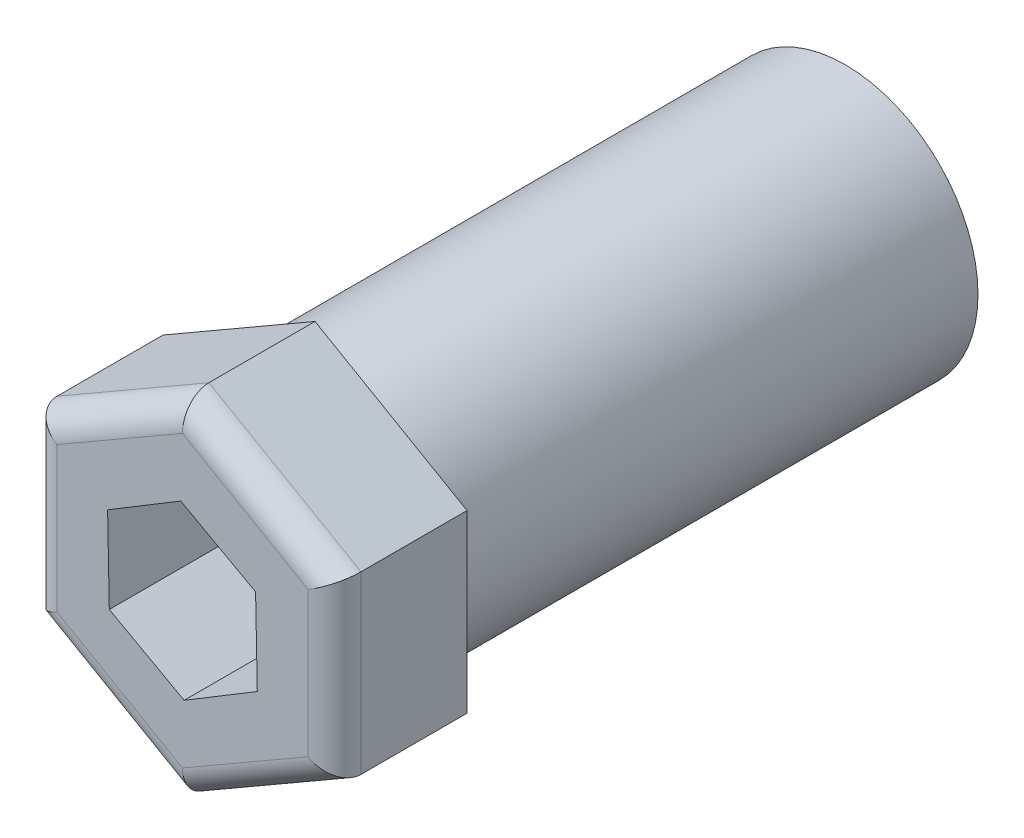
ISO-10303-21;
HEADER;
FILE_DESCRIPTION(('STEP AP214'),'2;1');
FILE_NAME('part.step','',(''),(''),'','','');
FILE_SCHEMA(('AUTOMOTIVE_DESIGN { 1 0 10303 214 1 1 1 1 }'));
ENDSEC;
DATA;
#1=APPLICATION_CONTEXT('core data for automotive mechanical design processes');
#2=APPLICATION_PROTOCOL_DEFINITION('international standard','automotive_design',2000,#1);
#3=PRODUCT_CONTEXT('',#1,'mechanical');
#4=PRODUCT('Part','Part','',(#3));
#5=PRODUCT_RELATED_PRODUCT_CATEGORY('part','',(#4));
#6=PRODUCT_DEFINITION_FORMATION('','',#4);
#7=PRODUCT_DEFINITION_CONTEXT('part definition',#1,'design');
#8=PRODUCT_DEFINITION('design','',#6,#7);
#9=PRODUCT_DEFINITION_SHAPE('','',#8);
#10=(LENGTH_UNIT() NAMED_UNIT(*) SI_UNIT(.MILLI.,.METRE.));
#11=(NAMED_UNIT(*) PLANE_ANGLE_UNIT() SI_UNIT($,.RADIAN.));
#12=(NAMED_UNIT(*) SI_UNIT($,.STERADIAN.) SOLID_ANGLE_UNIT());
#13=UNCERTAINTY_MEASURE_WITH_UNIT(LENGTH_MEASURE(1.E-05),#10,'distance_accuracy_value','');
#14=(GEOMETRIC_REPRESENTATION_CONTEXT(3) GLOBAL_UNCERTAINTY_ASSIGNED_CONTEXT((#13)) GLOBAL_UNIT_ASSIGNED_CONTEXT((#10,
#11,#12)) REPRESENTATION_CONTEXT('',''));
#15=CARTESIAN_POINT('',(0.,0.,0.));
#16=DIRECTION('',(0.,0.,1.));
#17=DIRECTION('',(1.,0.,0.));
#18=AXIS2_PLACEMENT_3D('',#15,#16,#17);
#19=CARTESIAN_POINT('',(0.,0.,4.));
#20=DIRECTION('',(0.,0.,-1.));
#21=DIRECTION('',(-1.,0.,0.));
#22=AXIS2_PLACEMENT_3D('',#19,#20,#21);
#23=CYLINDRICAL_SURFACE('',#22,1.);
#24=CARTESIAN_POINT('',(0.,0.,4.));
#25=DIRECTION('',(0.,0.,1.));
#26=DIRECTION('',(1.,0.,0.));
#27=AXIS2_PLACEMENT_3D('',#24,#25,#26);
#28=CIRCLE('',#27,1.);
#29=CARTESIAN_POINT('',(1.,0.,4.));
#30=VERTEX_POINT('',#29);
#31=EDGE_CURVE('E232',#30,#30,#28,.T.);
#32=ORIENTED_EDGE('',*,*,#31,.F.);
#33=EDGE_LOOP('',(#32));
#34=FACE_BOUND('',#33,.T.);
#35=CARTESIAN_POINT('',(0.,0.,0.));
#36=DIRECTION('',(0.,0.,1.));
#37=DIRECTION('',(1.,0.,0.));
#38=AXIS2_PLACEMENT_3D('',#35,#36,#37);
#39=CIRCLE('',#38,1.);
#40=CARTESIAN_POINT('',(1.,0.,0.));
#41=VERTEX_POINT('',#40);
#42=EDGE_CURVE('E231',#41,#41,#39,.T.);
#43=ORIENTED_EDGE('',*,*,#42,.T.);
#44=EDGE_LOOP('',(#43));
#45=FACE_BOUND('',#44,.T.);
#46=ADVANCED_FACE('F35',(#34,#45),#23,.T.);
#47=CARTESIAN_POINT('',(0.,0.,0.));
#48=DIRECTION('',(0.,0.,1.));
#49=DIRECTION('',(1.,0.,0.));
#50=AXIS2_PLACEMENT_3D('',#47,#48,#49);
#51=PLANE('',#50);
#52=ORIENTED_EDGE('',*,*,#42,.F.);
#53=EDGE_LOOP('',(#52));
#54=FACE_BOUND('',#53,.T.);
#55=ADVANCED_FACE('F326',(#54),#51,.F.);
#56=CARTESIAN_POINT('',(1.146400748658,0.661874780836902,5.));
#57=DIRECTION('',(-0.499999999999995,-0.866025403784441,0.));
#58=DIRECTION('',(0.866025403784442,-0.499999999999995,0.));
#59=AXIS2_PLACEMENT_3D('',#56,#57,#58);
#60=PLANE('',#59);
#61=DIRECTION('',(0.,0.,-1.));
#62=VECTOR('',#61,1.);
#63=CARTESIAN_POINT('',(0.,1.32374956167378,5.));
#64=LINE('',#63,#62);
#65=CARTESIAN_POINT('',(0.,1.32374956167378,4.8));
#66=VERTEX_POINT('',#65);
#67=CARTESIAN_POINT('',(0.,1.32374956167378,4.));
#68=VERTEX_POINT('',#67);
#69=EDGE_CURVE('E229',#66,#68,#64,.T.);
#70=ORIENTED_EDGE('',*,*,#69,.F.);
#71=DIRECTION('',(-0.866025403784442,0.499999999999995,0.));
#72=VECTOR('',#71,1.);
#73=CARTESIAN_POINT('',(1.146400748658,0.661874780836902,4.8));
#74=LINE('',#73,#72);
#75=CARTESIAN_POINT('',(1.146400748658,0.661874780836902,4.8));
#76=VERTEX_POINT('',#75);
#77=EDGE_CURVE('E44',#66,#76,#74,.F.);
#78=ORIENTED_EDGE('',*,*,#77,.T.);
#79=DIRECTION('',(0.,0.,-1.));
#80=VECTOR('',#79,1.);
#81=CARTESIAN_POINT('',(1.146400748658,0.661874780836902,5.));
#82=LINE('',#81,#80);
#83=CARTESIAN_POINT('',(1.146400748658,0.661874780836902,4.));
#84=VERTEX_POINT('',#83);
#85=EDGE_CURVE('E219',#76,#84,#82,.T.);
#86=ORIENTED_EDGE('',*,*,#85,.T.);
#87=DIRECTION('',(-0.866025403784441,0.499999999999995,0.));
#88=VECTOR('',#87,1.);
#89=CARTESIAN_POINT('',(1.146400748658,0.661874780836902,4.));
#90=LINE('',#89,#88);
#91=EDGE_CURVE('E194',#84,#68,#90,.T.);
#92=ORIENTED_EDGE('',*,*,#91,.T.);
#93=EDGE_LOOP('',(#70,#78,#86,#92));
#94=FACE_BOUND('',#93,.T.);
#95=ADVANCED_FACE('F317',(#94),#60,.F.);
#96=CARTESIAN_POINT('',(0.,1.32374956167378,5.));
#97=DIRECTION('',(0.500000000000001,-0.866025403784438,0.));
#98=DIRECTION('',(0.866025403784438,0.500000000000001,0.));
#99=AXIS2_PLACEMENT_3D('',#96,#97,#98);
#100=PLANE('',#99);
#101=DIRECTION('',(0.,0.,-1.));
#102=VECTOR('',#101,1.);
#103=CARTESIAN_POINT('',(-1.14640074865801,0.661874780836886,5.));
#104=LINE('',#103,#102);
#105=CARTESIAN_POINT('',(-1.14640074865801,0.661874780836886,4.8));
#106=VERTEX_POINT('',#105);
#107=CARTESIAN_POINT('',(-1.14640074865801,0.661874780836886,4.));
#108=VERTEX_POINT('',#107);
#109=EDGE_CURVE('E227',#106,#108,#104,.T.);
#110=ORIENTED_EDGE('',*,*,#109,.F.);
#111=DIRECTION('',(-0.866025403784438,-0.500000000000001,0.));
#112=VECTOR('',#111,1.);
#113=CARTESIAN_POINT('',(0.,1.32374956167378,4.8));
#114=LINE('',#113,#112);
#115=EDGE_CURVE('E59',#106,#66,#114,.F.);
#116=ORIENTED_EDGE('',*,*,#115,.T.);
#117=ORIENTED_EDGE('',*,*,#69,.T.);
#118=DIRECTION('',(-0.866025403784438,-0.500000000000001,0.));
#119=VECTOR('',#118,1.);
#120=CARTESIAN_POINT('',(0.,1.32374956167378,4.));
#121=LINE('',#120,#119);
#122=EDGE_CURVE('E204',#68,#108,#121,.T.);
#123=ORIENTED_EDGE('',*,*,#122,.T.);
#124=EDGE_LOOP('',(#110,#116,#117,#123));
#125=FACE_BOUND('',#124,.T.);
#126=ADVANCED_FACE('F318',(#125),#100,.F.);
#127=CARTESIAN_POINT('',(-1.14640074865801,0.661874780836886,5.));
#128=DIRECTION('',(1.,0.,0.));
#129=DIRECTION('',(0.,1.,0.));
#130=AXIS2_PLACEMENT_3D('',#127,#128,#129);
#131=PLANE('',#130);
#132=DIRECTION('',(0.,0.,-1.));
#133=VECTOR('',#132,1.);
#134=CARTESIAN_POINT('',(-1.146400748658,-0.661874780836894,5.));
#135=LINE('',#134,#133);
#136=CARTESIAN_POINT('',(-1.146400748658,-0.661874780836894,4.8));
#137=VERTEX_POINT('',#136);
#138=CARTESIAN_POINT('',(-1.146400748658,-0.661874780836894,4.));
#139=VERTEX_POINT('',#138);
#140=EDGE_CURVE('E225',#137,#139,#135,.T.);
#141=ORIENTED_EDGE('',*,*,#140,.F.);
#142=DIRECTION('',(0.,-1.,0.));
#143=VECTOR('',#142,1.);
#144=CARTESIAN_POINT('',(-1.14640074865801,0.661874780836886,4.8));
#145=LINE('',#144,#143);
#146=EDGE_CURVE('E255',#137,#106,#145,.F.);
#147=ORIENTED_EDGE('',*,*,#146,.T.);
#148=ORIENTED_EDGE('',*,*,#109,.T.);
#149=DIRECTION('',(0.,-1.,0.));
#150=VECTOR('',#149,1.);
#151=CARTESIAN_POINT('',(-1.14640074865801,0.661874780836886,4.));
#152=LINE('',#151,#150);
#153=EDGE_CURVE('E207',#108,#139,#152,.T.);
#154=ORIENTED_EDGE('',*,*,#153,.T.);
#155=EDGE_LOOP('',(#141,#147,#148,#154));
#156=FACE_BOUND('',#155,.T.);
#157=ADVANCED_FACE('F310',(#156),#131,.F.);
#158=CARTESIAN_POINT('',(-1.146400748658,-0.661874780836894,5.));
#159=DIRECTION('',(0.499999999999995,0.866025403784442,0.));
#160=DIRECTION('',(-0.866025403784442,0.499999999999995,0.));
#161=AXIS2_PLACEMENT_3D('',#158,#159,#160);
#162=PLANE('',#161);
#163=DIRECTION('',(0.,0.,-1.));
#164=VECTOR('',#163,1.);
#165=CARTESIAN_POINT('',(0.,-1.32374956167378,5.));
#166=LINE('',#165,#164);
#167=CARTESIAN_POINT('',(0.,-1.32374956167378,4.8));
#168=VERTEX_POINT('',#167);
#169=CARTESIAN_POINT('',(0.,-1.32374956167378,4.));
#170=VERTEX_POINT('',#169);
#171=EDGE_CURVE('E223',#168,#170,#166,.T.);
#172=ORIENTED_EDGE('',*,*,#171,.F.);
#173=DIRECTION('',(0.866025403784442,-0.499999999999995,0.));
#174=VECTOR('',#173,1.);
#175=CARTESIAN_POINT('',(-1.146400748658,-0.661874780836894,4.8));
#176=LINE('',#175,#174);
#177=EDGE_CURVE('E253',#168,#137,#176,.F.);
#178=ORIENTED_EDGE('',*,*,#177,.T.);
#179=ORIENTED_EDGE('',*,*,#140,.T.);
#180=DIRECTION('',(0.866025403784442,-0.499999999999995,0.));
#181=VECTOR('',#180,1.);
#182=CARTESIAN_POINT('',(-1.146400748658,-0.661874780836894,4.));
#183=LINE('',#182,#181);
#184=EDGE_CURVE('E210',#139,#170,#183,.T.);
#185=ORIENTED_EDGE('',*,*,#184,.T.);
#186=EDGE_LOOP('',(#172,#178,#179,#185));
#187=FACE_BOUND('',#186,.T.);
#188=ADVANCED_FACE('F308',(#187),#162,.F.);
#189=CARTESIAN_POINT('',(0.,-1.32374956167378,5.));
#190=DIRECTION('',(-0.500000000000007,0.866025403784435,0.));
#191=DIRECTION('',(-0.866025403784434,-0.500000000000007,0.));
#192=AXIS2_PLACEMENT_3D('',#189,#190,#191);
#193=PLANE('',#192);
#194=DIRECTION('',(0.,0.,-1.));
#195=VECTOR('',#194,1.);
#196=CARTESIAN_POINT('',(1.14640074865801,-0.661874780836878,5.));
#197=LINE('',#196,#195);
#198=CARTESIAN_POINT('',(1.14640074865801,-0.661874780836878,4.8));
#199=VERTEX_POINT('',#198);
#200=CARTESIAN_POINT('',(1.14640074865801,-0.661874780836878,4.));
#201=VERTEX_POINT('',#200);
#202=EDGE_CURVE('E221',#199,#201,#197,.T.);
#203=ORIENTED_EDGE('',*,*,#202,.F.);
#204=DIRECTION('',(0.866025403784434,0.500000000000007,0.));
#205=VECTOR('',#204,1.);
#206=CARTESIAN_POINT('',(0.,-1.32374956167378,4.8));
#207=LINE('',#206,#205);
#208=EDGE_CURVE('E250',#199,#168,#207,.F.);
#209=ORIENTED_EDGE('',*,*,#208,.T.);
#210=ORIENTED_EDGE('',*,*,#171,.T.);
#211=DIRECTION('',(0.866025403784434,0.500000000000007,0.));
#212=VECTOR('',#211,1.);
#213=CARTESIAN_POINT('',(0.,-1.32374956167378,4.));
#214=LINE('',#213,#212);
#215=EDGE_CURVE('E213',#170,#201,#214,.T.);
#216=ORIENTED_EDGE('',*,*,#215,.T.);
#217=EDGE_LOOP('',(#203,#209,#210,#216));
#218=FACE_BOUND('',#217,.T.);
#219=ADVANCED_FACE('F294',(#218),#193,.F.);
#220=CARTESIAN_POINT('',(1.14640074865801,-0.661874780836878,5.));
#221=DIRECTION('',(-1.,0.,0.));
#222=DIRECTION('',(0.,-1.,0.));
#223=AXIS2_PLACEMENT_3D('',#220,#221,#222);
#224=PLANE('',#223);
#225=ORIENTED_EDGE('',*,*,#85,.F.);
#226=DIRECTION('',(0.,1.,0.));
#227=VECTOR('',#226,1.);
#228=CARTESIAN_POINT('',(1.14640074865801,-0.661874780836878,4.8));
#229=LINE('',#228,#227);
#230=EDGE_CURVE('E11',#76,#199,#229,.F.);
#231=ORIENTED_EDGE('',*,*,#230,.T.);
#232=ORIENTED_EDGE('',*,*,#202,.T.);
#233=DIRECTION('',(0.,1.,0.));
#234=VECTOR('',#233,1.);
#235=CARTESIAN_POINT('',(1.14640074865801,-0.661874780836878,4.));
#236=LINE('',#235,#234);
#237=EDGE_CURVE('E216',#201,#84,#236,.T.);
#238=ORIENTED_EDGE('',*,*,#237,.T.);
#239=EDGE_LOOP('',(#225,#231,#232,#238));
#240=FACE_BOUND('',#239,.T.);
#241=ADVANCED_FACE('F291',(#240),#224,.F.);
#242=CARTESIAN_POINT('',(0.,0.,5.));
#243=DIRECTION('',(0.,0.,1.));
#244=DIRECTION('',(1.,0.,0.));
#245=AXIS2_PLACEMENT_3D('',#242,#243,#244);
#246=PLANE('',#245);
#247=DIRECTION('',(0.866025403784442,-0.499999999999995,0.));
#248=VECTOR('',#247,1.);
#249=CARTESIAN_POINT('',(0.100000000000008,-1.15054448091689,5.));
#250=LINE('',#249,#248);
#251=CARTESIAN_POINT('',(-0.946400748658004,-0.546404726998968,5.));
#252=VERTEX_POINT('',#251);
#253=CARTESIAN_POINT('',(0.,-1.09280945399793,5.));
#254=VERTEX_POINT('',#253);
#255=EDGE_CURVE('E245',#252,#254,#250,.T.);
#256=ORIENTED_EDGE('',*,*,#255,.T.);
#257=DIRECTION('',(0.866025403784434,0.500000000000007,0.));
#258=VECTOR('',#257,1.);
#259=CARTESIAN_POINT('',(1.04640074865801,-0.488669700079991,5.));
#260=LINE('',#259,#258);
#261=CARTESIAN_POINT('',(0.946400748658012,-0.546404726998954,5.));
#262=VERTEX_POINT('',#261);
#263=EDGE_CURVE('E247',#254,#262,#260,.T.);
#264=ORIENTED_EDGE('',*,*,#263,.T.);
#265=DIRECTION('',(0.,1.,0.));
#266=VECTOR('',#265,1.);
#267=CARTESIAN_POINT('',(0.946400748657999,0.6618747808369,5.));
#268=LINE('',#267,#266);
#269=CARTESIAN_POINT('',(0.946400748658001,0.546404726998975,5.));
#270=VERTEX_POINT('',#269);
#271=EDGE_CURVE('E235',#262,#270,#268,.T.);
#272=ORIENTED_EDGE('',*,*,#271,.T.);
#273=DIRECTION('',(-0.866025403784442,0.499999999999995,0.));
#274=VECTOR('',#273,1.);
#275=CARTESIAN_POINT('',(-0.0999999999999992,1.15054448091689,5.));
#276=LINE('',#275,#274);
#277=CARTESIAN_POINT('',(0.,1.09280945399793,5.));
#278=VERTEX_POINT('',#277);
#279=EDGE_CURVE('E239',#270,#278,#276,.T.);
#280=ORIENTED_EDGE('',*,*,#279,.T.);
#281=DIRECTION('',(-0.866025403784438,-0.500000000000001,0.));
#282=VECTOR('',#281,1.);
#283=CARTESIAN_POINT('',(-1.04640074865801,0.488669700079998,5.));
#284=LINE('',#283,#282);
#285=CARTESIAN_POINT('',(-0.946400748658008,0.546404726998961,5.));
#286=VERTEX_POINT('',#285);
#287=EDGE_CURVE('E241',#278,#286,#284,.T.);
#288=ORIENTED_EDGE('',*,*,#287,.T.);
#289=DIRECTION('',(0.,-1.,0.));
#290=VECTOR('',#289,1.);
#291=CARTESIAN_POINT('',(-0.946400748658004,-0.661874780836894,5.));
#292=LINE('',#291,#290);
#293=EDGE_CURVE('E243',#286,#252,#292,.T.);
#294=ORIENTED_EDGE('',*,*,#293,.T.);
#295=EDGE_LOOP('',(#256,#264,#272,#280,#288,#294));
#296=FACE_BOUND('',#295,.T.);
#297=DIRECTION('',(-0.85593161313809,-0.517089038397476,0.));
#298=VECTOR('',#297,1.);
#299=CARTESIAN_POINT('',(-0.0127913436107154,0.644388935955829,5.));
#300=LINE('',#299,#298);
#301=CARTESIAN_POINT('',(-0.0127913436107154,0.644388935955829,5.));
#302=VERTEX_POINT('',#301);
#303=CARTESIAN_POINT('',(-0.564452860260729,0.3111168394625,5.));
#304=VERTEX_POINT('',#303);
#305=EDGE_CURVE('E150',#302,#304,#300,.T.);
#306=ORIENTED_EDGE('',*,*,#305,.F.);
#307=DIRECTION('',(-0.875778049839726,0.482714001681043,0.));
#308=VECTOR('',#307,1.);
#309=CARTESIAN_POINT('',(0.551661516650015,0.33327209649333,5.));
#310=LINE('',#309,#308);
#311=CARTESIAN_POINT('',(0.551661516650015,0.33327209649333,5.));
#312=VERTEX_POINT('',#311);
#313=EDGE_CURVE('E168',#312,#302,#310,.T.);
#314=ORIENTED_EDGE('',*,*,#313,.F.);
#315=DIRECTION('',(-0.019846436701636,0.999803040078519,0.));
#316=VECTOR('',#315,1.);
#317=CARTESIAN_POINT('',(0.56445286026073,-0.3111168394625,5.));
#318=LINE('',#317,#316);
#319=CARTESIAN_POINT('',(0.56445286026073,-0.3111168394625,5.));
#320=VERTEX_POINT('',#319);
#321=EDGE_CURVE('E171',#320,#312,#318,.T.);
#322=ORIENTED_EDGE('',*,*,#321,.F.);
#323=DIRECTION('',(0.85593161313809,0.517089038397476,0.));
#324=VECTOR('',#323,1.);
#325=CARTESIAN_POINT('',(0.0127913436107152,-0.644388935955829,5.));
#326=LINE('',#325,#324);
#327=CARTESIAN_POINT('',(0.0127913436107152,-0.644388935955829,5.));
#328=VERTEX_POINT('',#327);
#329=EDGE_CURVE('E187',#328,#320,#326,.T.);
#330=ORIENTED_EDGE('',*,*,#329,.F.);
#331=DIRECTION('',(0.875778049839726,-0.482714001681043,0.));
#332=VECTOR('',#331,1.);
#333=CARTESIAN_POINT('',(-0.551661516650014,-0.33327209649333,5.));
#334=LINE('',#333,#332);
#335=CARTESIAN_POINT('',(-0.551661516650014,-0.33327209649333,5.));
#336=VERTEX_POINT('',#335);
#337=EDGE_CURVE('E184',#336,#328,#334,.T.);
#338=ORIENTED_EDGE('',*,*,#337,.F.);
#339=DIRECTION('',(0.0198464367016358,-0.999803040078519,0.));
#340=VECTOR('',#339,1.);
#341=CARTESIAN_POINT('',(-0.564452860260729,0.3111168394625,5.));
#342=LINE('',#341,#340);
#343=EDGE_CURVE('E182',#304,#336,#342,.T.);
#344=ORIENTED_EDGE('',*,*,#343,.F.);
#345=EDGE_LOOP('',(#306,#314,#322,#330,#338,#344));
#346=FACE_BOUND('',#345,.T.);
#347=ADVANCED_FACE('F377',(#296,#346),#246,.T.);
#348=CARTESIAN_POINT('',(0.,0.,4.));
#349=DIRECTION('',(0.,0.,1.));
#350=DIRECTION('',(1.,0.,0.));
#351=AXIS2_PLACEMENT_3D('',#348,#349,#350);
#352=PLANE('',#351);
#353=ORIENTED_EDGE('',*,*,#31,.T.);
#354=EDGE_LOOP('',(#353));
#355=FACE_BOUND('',#354,.T.);
#356=ORIENTED_EDGE('',*,*,#91,.F.);
#357=ORIENTED_EDGE('',*,*,#237,.F.);
#358=ORIENTED_EDGE('',*,*,#215,.F.);
#359=ORIENTED_EDGE('',*,*,#184,.F.);
#360=ORIENTED_EDGE('',*,*,#153,.F.);
#361=ORIENTED_EDGE('',*,*,#122,.F.);
#362=EDGE_LOOP('',(#356,#357,#358,#359,#360,#361));
#363=FACE_BOUND('',#362,.T.);
#364=ADVANCED_FACE('F316',(#355,#363),#352,.F.);
#365=CARTESIAN_POINT('',(-0.0127913436107154,0.644388935955829,4.));
#366=DIRECTION('',(-0.517089038397476,0.85593161313809,0.));
#367=DIRECTION('',(-0.85593161313809,-0.517089038397476,0.));
#368=AXIS2_PLACEMENT_3D('',#365,#366,#367);
#369=PLANE('',#368);
#370=ORIENTED_EDGE('',*,*,#305,.T.);
#371=DIRECTION('',(0.,0.,1.));
#372=VECTOR('',#371,1.);
#373=CARTESIAN_POINT('',(-0.564452860260729,0.3111168394625,4.));
#374=LINE('',#373,#372);
#375=CARTESIAN_POINT('',(-0.564452860260729,0.3111168394625,4.));
#376=VERTEX_POINT('',#375);
#377=EDGE_CURVE('E143',#376,#304,#374,.T.);
#378=ORIENTED_EDGE('',*,*,#377,.F.);
#379=DIRECTION('',(-0.85593161313809,-0.517089038397476,0.));
#380=VECTOR('',#379,1.);
#381=CARTESIAN_POINT('',(-0.0127913436107154,0.644388935955829,4.));
#382=LINE('',#381,#380);
#383=CARTESIAN_POINT('',(-0.0127913436107154,0.644388935955829,4.));
#384=VERTEX_POINT('',#383);
#385=EDGE_CURVE('E147',#384,#376,#382,.T.);
#386=ORIENTED_EDGE('',*,*,#385,.F.);
#387=DIRECTION('',(0.,0.,1.));
#388=VECTOR('',#387,1.);
#389=CARTESIAN_POINT('',(-0.0127913436107154,0.644388935955829,4.));
#390=LINE('',#389,#388);
#391=EDGE_CURVE('E192',#384,#302,#390,.T.);
#392=ORIENTED_EDGE('',*,*,#391,.T.);
#393=EDGE_LOOP('',(#370,#378,#386,#392));
#394=FACE_BOUND('',#393,.T.);
#395=ADVANCED_FACE('F145',(#394),#369,.F.);
#396=CARTESIAN_POINT('',(0.551661516650015,0.33327209649333,4.));
#397=DIRECTION('',(0.482714001681043,0.875778049839726,0.));
#398=DIRECTION('',(-0.875778049839726,0.482714001681043,0.));
#399=AXIS2_PLACEMENT_3D('',#396,#397,#398);
#400=PLANE('',#399);
#401=ORIENTED_EDGE('',*,*,#313,.T.);
#402=ORIENTED_EDGE('',*,*,#391,.F.);
#403=DIRECTION('',(-0.875778049839726,0.482714001681043,0.));
#404=VECTOR('',#403,1.);
#405=CARTESIAN_POINT('',(0.551661516650015,0.33327209649333,4.));
#406=LINE('',#405,#404);
#407=CARTESIAN_POINT('',(0.551661516650015,0.33327209649333,4.));
#408=VERTEX_POINT('',#407);
#409=EDGE_CURVE('E155',#408,#384,#406,.T.);
#410=ORIENTED_EDGE('',*,*,#409,.F.);
#411=DIRECTION('',(0.,0.,1.));
#412=VECTOR('',#411,1.);
#413=CARTESIAN_POINT('',(0.551661516650015,0.33327209649333,4.));
#414=LINE('',#413,#412);
#415=EDGE_CURVE('E195',#408,#312,#414,.T.);
#416=ORIENTED_EDGE('',*,*,#415,.T.);
#417=EDGE_LOOP('',(#401,#402,#410,#416));
#418=FACE_BOUND('',#417,.T.);
#419=ADVANCED_FACE('F360',(#418),#400,.F.);
#420=CARTESIAN_POINT('',(0.56445286026073,-0.3111168394625,4.));
#421=DIRECTION('',(0.999803040078519,0.019846436701636,0.));
#422=DIRECTION('',(-0.019846436701636,0.999803040078519,0.));
#423=AXIS2_PLACEMENT_3D('',#420,#421,#422);
#424=PLANE('',#423);
#425=ORIENTED_EDGE('',*,*,#321,.T.);
#426=ORIENTED_EDGE('',*,*,#415,.F.);
#427=DIRECTION('',(-0.019846436701636,0.999803040078519,0.));
#428=VECTOR('',#427,1.);
#429=CARTESIAN_POINT('',(0.56445286026073,-0.3111168394625,4.));
#430=LINE('',#429,#428);
#431=CARTESIAN_POINT('',(0.56445286026073,-0.3111168394625,4.));
#432=VERTEX_POINT('',#431);
#433=EDGE_CURVE('E178',#432,#408,#430,.T.);
#434=ORIENTED_EDGE('',*,*,#433,.F.);
#435=DIRECTION('',(0.,0.,1.));
#436=VECTOR('',#435,1.);
#437=CARTESIAN_POINT('',(0.56445286026073,-0.3111168394625,4.));
#438=LINE('',#437,#436);
#439=EDGE_CURVE('E197',#432,#320,#438,.T.);
#440=ORIENTED_EDGE('',*,*,#439,.T.);
#441=EDGE_LOOP('',(#425,#426,#434,#440));
#442=FACE_BOUND('',#441,.T.);
#443=ADVANCED_FACE('F363',(#442),#424,.F.);
#444=CARTESIAN_POINT('',(0.0127913436107152,-0.644388935955829,4.));
#445=DIRECTION('',(0.517089038397476,-0.855931613138091,0.));
#446=DIRECTION('',(0.85593161313809,0.517089038397476,0.));
#447=AXIS2_PLACEMENT_3D('',#444,#445,#446);
#448=PLANE('',#447);
#449=ORIENTED_EDGE('',*,*,#329,.T.);
#450=ORIENTED_EDGE('',*,*,#439,.F.);
#451=DIRECTION('',(0.85593161313809,0.517089038397476,0.));
#452=VECTOR('',#451,1.);
#453=CARTESIAN_POINT('',(0.0127913436107152,-0.644388935955829,4.));
#454=LINE('',#453,#452);
#455=CARTESIAN_POINT('',(0.0127913436107152,-0.644388935955829,4.));
#456=VERTEX_POINT('',#455);
#457=EDGE_CURVE('E175',#456,#432,#454,.T.);
#458=ORIENTED_EDGE('',*,*,#457,.F.);
#459=DIRECTION('',(0.,0.,1.));
#460=VECTOR('',#459,1.);
#461=CARTESIAN_POINT('',(0.0127913436107152,-0.644388935955829,4.));
#462=LINE('',#461,#460);
#463=EDGE_CURVE('E199',#456,#328,#462,.T.);
#464=ORIENTED_EDGE('',*,*,#463,.T.);
#465=EDGE_LOOP('',(#449,#450,#458,#464));
#466=FACE_BOUND('',#465,.T.);
#467=ADVANCED_FACE('F367',(#466),#448,.F.);
#468=CARTESIAN_POINT('',(-0.551661516650014,-0.33327209649333,4.));
#469=DIRECTION('',(-0.482714001681043,-0.875778049839726,0.));
#470=DIRECTION('',(0.875778049839727,-0.482714001681043,0.));
#471=AXIS2_PLACEMENT_3D('',#468,#469,#470);
#472=PLANE('',#471);
#473=ORIENTED_EDGE('',*,*,#337,.T.);
#474=ORIENTED_EDGE('',*,*,#463,.F.);
#475=DIRECTION('',(0.875778049839726,-0.482714001681043,0.));
#476=VECTOR('',#475,1.);
#477=CARTESIAN_POINT('',(-0.551661516650014,-0.33327209649333,4.));
#478=LINE('',#477,#476);
#479=CARTESIAN_POINT('',(-0.551661516650014,-0.33327209649333,4.));
#480=VERTEX_POINT('',#479);
#481=EDGE_CURVE('E163',#480,#456,#478,.T.);
#482=ORIENTED_EDGE('',*,*,#481,.F.);
#483=DIRECTION('',(0.,0.,1.));
#484=VECTOR('',#483,1.);
#485=CARTESIAN_POINT('',(-0.551661516650014,-0.33327209649333,4.));
#486=LINE('',#485,#484);
#487=EDGE_CURVE('E154',#480,#336,#486,.T.);
#488=ORIENTED_EDGE('',*,*,#487,.T.);
#489=EDGE_LOOP('',(#473,#474,#482,#488));
#490=FACE_BOUND('',#489,.T.);
#491=ADVANCED_FACE('F357',(#490),#472,.F.);
#492=CARTESIAN_POINT('',(-0.564452860260729,0.3111168394625,4.));
#493=DIRECTION('',(-0.999803040078519,-0.0198464367016358,0.));
#494=DIRECTION('',(0.0198464367016358,-0.999803040078519,0.));
#495=AXIS2_PLACEMENT_3D('',#492,#493,#494);
#496=PLANE('',#495);
#497=ORIENTED_EDGE('',*,*,#343,.T.);
#498=ORIENTED_EDGE('',*,*,#487,.F.);
#499=DIRECTION('',(0.0198464367016358,-0.999803040078519,0.));
#500=VECTOR('',#499,1.);
#501=CARTESIAN_POINT('',(-0.564452860260729,0.3111168394625,4.));
#502=LINE('',#501,#500);
#503=EDGE_CURVE('E158',#376,#480,#502,.T.);
#504=ORIENTED_EDGE('',*,*,#503,.F.);
#505=ORIENTED_EDGE('',*,*,#377,.T.);
#506=EDGE_LOOP('',(#497,#498,#504,#505));
#507=FACE_BOUND('',#506,.T.);
#508=ADVANCED_FACE('F159',(#507),#496,.F.);
#509=CARTESIAN_POINT('',(0.,0.,4.));
#510=DIRECTION('',(0.,0.,1.));
#511=DIRECTION('',(1.,0.,0.));
#512=AXIS2_PLACEMENT_3D('',#509,#510,#511);
#513=PLANE('',#512);
#514=ORIENTED_EDGE('',*,*,#385,.T.);
#515=ORIENTED_EDGE('',*,*,#503,.T.);
#516=ORIENTED_EDGE('',*,*,#481,.T.);
#517=ORIENTED_EDGE('',*,*,#457,.T.);
#518=ORIENTED_EDGE('',*,*,#433,.T.);
#519=ORIENTED_EDGE('',*,*,#409,.T.);
#520=EDGE_LOOP('',(#514,#515,#516,#517,#518,#519));
#521=FACE_BOUND('',#520,.T.);
#522=ADVANCED_FACE('F165',(#521),#513,.T.);
#523=CARTESIAN_POINT('',(-0.473200374329004,0.819607090498444,4.8));
#524=DIRECTION('',(0.866025403784438,0.500000000000001,0.));
#525=DIRECTION('',(-0.500000000000001,0.866025403784438,0.));
#526=AXIS2_PLACEMENT_3D('',#523,#524,#525);
#527=CYLINDRICAL_SURFACE('',#526,0.2);
#528=CARTESIAN_POINT('',(0.,1.09280945399793,4.8));
#529=DIRECTION('',(1.,0.,0.));
#530=DIRECTION('',(0.,-1.,0.));
#531=AXIS2_PLACEMENT_3D('',#528,#529,#530);
#532=ELLIPSE('',#531,0.23094010767585,0.2);
#533=EDGE_CURVE('E268',#66,#278,#532,.T.);
#534=ORIENTED_EDGE('',*,*,#533,.F.);
#535=ORIENTED_EDGE('',*,*,#115,.F.);
#536=CARTESIAN_POINT('',(-0.946400748658008,0.546404726998961,4.8));
#537=DIRECTION('',(0.499999999999998,0.86602540378444,0.));
#538=DIRECTION('',(0.86602540378444,-0.499999999999998,0.));
#539=AXIS2_PLACEMENT_3D('',#536,#537,#538);
#540=ELLIPSE('',#539,0.23094010767585,0.2);
#541=EDGE_CURVE('E39',#286,#106,#540,.F.);
#542=ORIENTED_EDGE('',*,*,#541,.F.);
#543=ORIENTED_EDGE('',*,*,#287,.F.);
#544=EDGE_LOOP('',(#534,#535,#542,#543));
#545=FACE_BOUND('',#544,.T.);
#546=ADVANCED_FACE('F37',(#545),#527,.T.);
#547=CARTESIAN_POINT('',(-0.946400748658006,0.,4.8));
#548=DIRECTION('',(0.,1.,0.));
#549=DIRECTION('',(-1.,0.,0.));
#550=AXIS2_PLACEMENT_3D('',#547,#548,#549);
#551=CYLINDRICAL_SURFACE('',#550,0.2);
#552=ORIENTED_EDGE('',*,*,#541,.T.);
#553=ORIENTED_EDGE('',*,*,#146,.F.);
#554=CARTESIAN_POINT('',(-0.946400748658004,-0.546404726998968,4.8));
#555=DIRECTION('',(-0.500000000000004,0.866025403784436,0.));
#556=DIRECTION('',(0.866025403784436,0.500000000000004,0.));
#557=AXIS2_PLACEMENT_3D('',#554,#555,#556);
#558=ELLIPSE('',#557,0.23094010767585,0.2);
#559=EDGE_CURVE('E266',#252,#137,#558,.F.);
#560=ORIENTED_EDGE('',*,*,#559,.F.);
#561=ORIENTED_EDGE('',*,*,#293,.F.);
#562=EDGE_LOOP('',(#552,#553,#560,#561));
#563=FACE_BOUND('',#562,.T.);
#564=ADVANCED_FACE('F278',(#563),#551,.T.);
#565=CARTESIAN_POINT('',(0.473200374329001,0.819607090498452,4.8));
#566=DIRECTION('',(0.866025403784442,-0.499999999999995,0.));
#567=DIRECTION('',(0.499999999999995,0.866025403784441,0.));
#568=AXIS2_PLACEMENT_3D('',#565,#566,#567);
#569=CYLINDRICAL_SURFACE('',#568,0.2);
#570=ORIENTED_EDGE('',*,*,#533,.T.);
#571=ORIENTED_EDGE('',*,*,#279,.F.);
#572=CARTESIAN_POINT('',(0.946400748658001,0.546404726998975,4.8));
#573=DIRECTION('',(0.500000000000007,-0.866025403784435,0.));
#574=DIRECTION('',(-0.866025403784435,-0.500000000000007,0.));
#575=AXIS2_PLACEMENT_3D('',#572,#573,#574);
#576=ELLIPSE('',#575,0.23094010767585,0.2);
#577=EDGE_CURVE('E263',#76,#270,#576,.T.);
#578=ORIENTED_EDGE('',*,*,#577,.F.);
#579=ORIENTED_EDGE('',*,*,#77,.F.);
#580=EDGE_LOOP('',(#570,#571,#578,#579));
#581=FACE_BOUND('',#580,.T.);
#582=ADVANCED_FACE('F283',(#581),#569,.T.);
#583=CARTESIAN_POINT('',(-0.473200374328998,-0.819607090498448,4.8));
#584=DIRECTION('',(-0.866025403784442,0.499999999999995,0.));
#585=DIRECTION('',(-0.499999999999995,-0.866025403784442,0.));
#586=AXIS2_PLACEMENT_3D('',#583,#584,#585);
#587=CYLINDRICAL_SURFACE('',#586,0.2);
#588=ORIENTED_EDGE('',*,*,#559,.T.);
#589=ORIENTED_EDGE('',*,*,#177,.F.);
#590=CARTESIAN_POINT('',(0.,-1.09280945399793,4.8));
#591=DIRECTION('',(-1.,0.,0.));
#592=DIRECTION('',(0.,1.,0.));
#593=AXIS2_PLACEMENT_3D('',#590,#591,#592);
#594=ELLIPSE('',#593,0.23094010767585,0.2);
#595=EDGE_CURVE('E261',#254,#168,#594,.F.);
#596=ORIENTED_EDGE('',*,*,#595,.F.);
#597=ORIENTED_EDGE('',*,*,#255,.F.);
#598=EDGE_LOOP('',(#588,#589,#596,#597));
#599=FACE_BOUND('',#598,.T.);
#600=ADVANCED_FACE('F305',(#599),#587,.T.);
#601=CARTESIAN_POINT('',(0.946400748658006,0.,4.8));
#602=DIRECTION('',(0.,-1.,0.));
#603=DIRECTION('',(1.,0.,0.));
#604=AXIS2_PLACEMENT_3D('',#601,#602,#603);
#605=CYLINDRICAL_SURFACE('',#604,0.2);
#606=ORIENTED_EDGE('',*,*,#577,.T.);
#607=ORIENTED_EDGE('',*,*,#271,.F.);
#608=CARTESIAN_POINT('',(0.946400748658012,-0.546404726998955,4.8));
#609=DIRECTION('',(-0.499999999999992,-0.866025403784443,0.));
#610=DIRECTION('',(0.866025403784443,-0.499999999999992,0.));
#611=AXIS2_PLACEMENT_3D('',#608,#609,#610);
#612=ELLIPSE('',#611,0.23094010767585,0.2);
#613=EDGE_CURVE('E259',#199,#262,#612,.T.);
#614=ORIENTED_EDGE('',*,*,#613,.F.);
#615=ORIENTED_EDGE('',*,*,#230,.F.);
#616=EDGE_LOOP('',(#606,#607,#614,#615));
#617=FACE_BOUND('',#616,.T.);
#618=ADVANCED_FACE('F288',(#617),#605,.T.);
#619=CARTESIAN_POINT('',(0.47320037432901,-0.819607090498441,4.8));
#620=DIRECTION('',(-0.866025403784434,-0.500000000000007,0.));
#621=DIRECTION('',(0.500000000000007,-0.866025403784435,0.));
#622=AXIS2_PLACEMENT_3D('',#619,#620,#621);
#623=CYLINDRICAL_SURFACE('',#622,0.2);
#624=ORIENTED_EDGE('',*,*,#595,.T.);
#625=ORIENTED_EDGE('',*,*,#208,.F.);
#626=ORIENTED_EDGE('',*,*,#613,.T.);
#627=ORIENTED_EDGE('',*,*,#263,.F.);
#628=EDGE_LOOP('',(#624,#625,#626,#627));
#629=FACE_BOUND('',#628,.T.);
#630=ADVANCED_FACE('F299',(#629),#623,.T.);
#631=CLOSED_SHELL('',(#46,#55,#95,#126,#157,#188,#219,#241,#347,#364,#395,#419,#443,#467,#491,
#508,#522,#546,#564,#582,#600,#618,#630));
#632=MANIFOLD_SOLID_BREP('B2',#631);
#633=ADVANCED_BREP_SHAPE_REPRESENTATION('',(#18,#632),#14);
#634=SHAPE_DEFINITION_REPRESENTATION(#9,#633);
ENDSEC;
END-ISO-10303-21;
